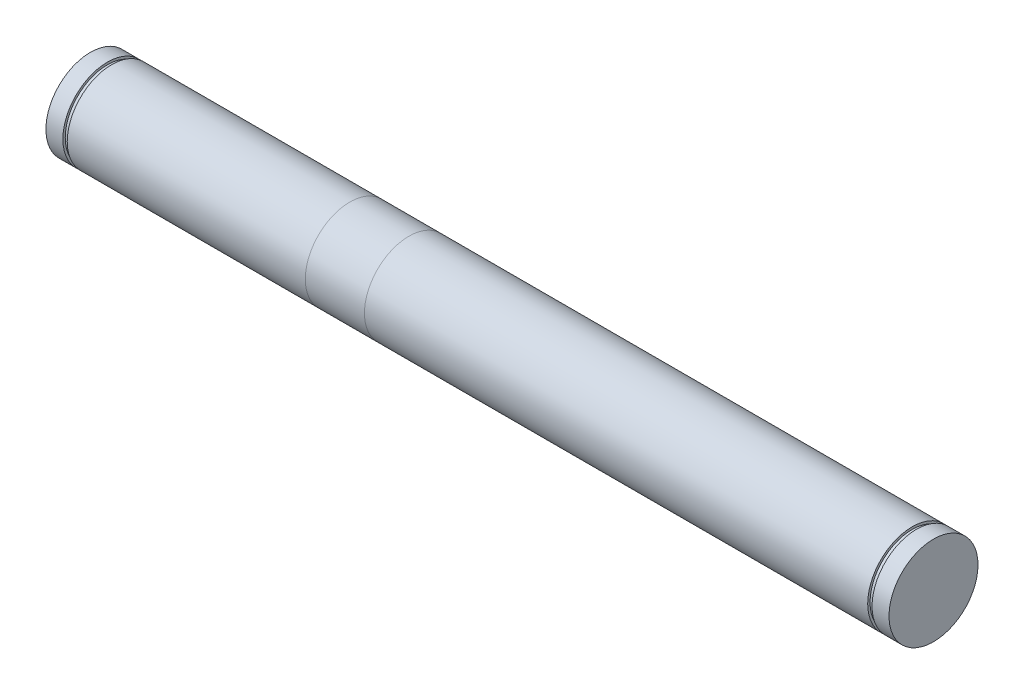
ISO-10303-21;
HEADER;
FILE_DESCRIPTION(('STEP AP214'),'2;1');
FILE_NAME('part.step','',(''),(''),'','','');
FILE_SCHEMA(('AUTOMOTIVE_DESIGN { 1 0 10303 214 1 1 1 1 }'));
ENDSEC;
DATA;
#1=APPLICATION_CONTEXT('core data for automotive mechanical design processes');
#2=APPLICATION_PROTOCOL_DEFINITION('international standard','automotive_design',2000,#1);
#3=PRODUCT_CONTEXT('',#1,'mechanical');
#4=PRODUCT('Part','Part','',(#3));
#5=PRODUCT_RELATED_PRODUCT_CATEGORY('part','',(#4));
#6=PRODUCT_DEFINITION_FORMATION('','',#4);
#7=PRODUCT_DEFINITION_CONTEXT('part definition',#1,'design');
#8=PRODUCT_DEFINITION('design','',#6,#7);
#9=PRODUCT_DEFINITION_SHAPE('','',#8);
#10=(LENGTH_UNIT() NAMED_UNIT(*) SI_UNIT(.MILLI.,.METRE.));
#11=(NAMED_UNIT(*) PLANE_ANGLE_UNIT() SI_UNIT($,.RADIAN.));
#12=(NAMED_UNIT(*) SI_UNIT($,.STERADIAN.) SOLID_ANGLE_UNIT());
#13=UNCERTAINTY_MEASURE_WITH_UNIT(LENGTH_MEASURE(1.E-05),#10,'distance_accuracy_value','');
#14=(GEOMETRIC_REPRESENTATION_CONTEXT(3) GLOBAL_UNCERTAINTY_ASSIGNED_CONTEXT((#13)) GLOBAL_UNIT_ASSIGNED_CONTEXT((#10,
#11,#12)) REPRESENTATION_CONTEXT('',''));
#15=CARTESIAN_POINT('',(0.,0.,0.));
#16=DIRECTION('',(0.,0.,1.));
#17=DIRECTION('',(1.,0.,0.));
#18=AXIS2_PLACEMENT_3D('',#15,#16,#17);
#19=CARTESIAN_POINT('',(180.,0.,0.));
#20=DIRECTION('',(1.,0.,0.));
#21=DIRECTION('',(0.,0.,-1.));
#22=AXIS2_PLACEMENT_3D('',#19,#20,#21);
#23=CYLINDRICAL_SURFACE('',#22,19.001);
#24=CARTESIAN_POINT('',(-44.,0.,0.));
#25=DIRECTION('',(1.,0.,0.));
#26=DIRECTION('',(0.,0.,-1.));
#27=AXIS2_PLACEMENT_3D('',#24,#25,#26);
#28=CIRCLE('',#27,19.001);
#29=CARTESIAN_POINT('',(-44.,0.,-19.001));
#30=VERTEX_POINT('',#29);
#31=EDGE_CURVE('E67',#30,#30,#28,.T.);
#32=ORIENTED_EDGE('',*,*,#31,.F.);
#33=EDGE_LOOP('',(#32));
#34=FACE_BOUND('',#33,.T.);
#35=CARTESIAN_POINT('',(-69.2296190995185,0.,0.));
#36=DIRECTION('',(-1.,0.,0.));
#37=DIRECTION('',(0.,0.,1.));
#38=AXIS2_PLACEMENT_3D('',#35,#36,#37);
#39=CIRCLE('',#38,19.001);
#40=CARTESIAN_POINT('',(-69.2296190995185,0.,19.001));
#41=VERTEX_POINT('',#40);
#42=EDGE_CURVE('E51',#41,#41,#39,.F.);
#43=ORIENTED_EDGE('',*,*,#42,.T.);
#44=EDGE_LOOP('',(#43));
#45=FACE_BOUND('',#44,.T.);
#46=ADVANCED_FACE('F47',(#34,#45),#23,.T.);
#47=CARTESIAN_POINT('',(180.,0.,0.));
#48=DIRECTION('',(1.,0.,0.));
#49=DIRECTION('',(0.,0.,-1.));
#50=AXIS2_PLACEMENT_3D('',#47,#48,#49);
#51=CYLINDRICAL_SURFACE('',#50,19.);
#52=CARTESIAN_POINT('',(-44.,0.,0.));
#53=DIRECTION('',(1.,0.,0.));
#54=DIRECTION('',(0.,0.,-1.));
#55=AXIS2_PLACEMENT_3D('',#52,#53,#54);
#56=CIRCLE('',#55,19.);
#57=CARTESIAN_POINT('',(-44.,0.,-19.));
#58=VERTEX_POINT('',#57);
#59=EDGE_CURVE('E61',#58,#58,#56,.T.);
#60=ORIENTED_EDGE('',*,*,#59,.T.);
#61=EDGE_LOOP('',(#60));
#62=FACE_BOUND('',#61,.T.);
#63=CARTESIAN_POINT('',(170.9,0.,0.));
#64=DIRECTION('',(-1.,0.,0.));
#65=DIRECTION('',(0.,0.,1.));
#66=AXIS2_PLACEMENT_3D('',#63,#64,#65);
#67=CIRCLE('',#66,19.);
#68=CARTESIAN_POINT('',(170.9,0.,19.));
#69=VERTEX_POINT('',#68);
#70=EDGE_CURVE('E83',#69,#69,#67,.T.);
#71=ORIENTED_EDGE('',*,*,#70,.T.);
#72=EDGE_LOOP('',(#71));
#73=FACE_BOUND('',#72,.T.);
#74=ADVANCED_FACE('F129',(#62,#73),#51,.T.);
#75=CARTESIAN_POINT('',(-44.,19.001,0.));
#76=DIRECTION('',(1.,0.,0.));
#77=DIRECTION('',(0.,0.,-1.));
#78=AXIS2_PLACEMENT_3D('',#75,#76,#77);
#79=PLANE('',#78);
#80=ORIENTED_EDGE('',*,*,#31,.T.);
#81=EDGE_LOOP('',(#80));
#82=FACE_BOUND('',#81,.T.);
#83=ORIENTED_EDGE('',*,*,#59,.F.);
#84=EDGE_LOOP('',(#83));
#85=FACE_BOUND('',#84,.T.);
#86=ADVANCED_FACE('F137',(#82,#85),#79,.T.);
#87=CARTESIAN_POINT('',(170.9,19.,0.));
#88=DIRECTION('',(1.,0.,0.));
#89=DIRECTION('',(0.,0.,-1.));
#90=AXIS2_PLACEMENT_3D('',#87,#88,#89);
#91=PLANE('',#90);
#92=CARTESIAN_POINT('',(170.9,0.,0.));
#93=DIRECTION('',(-1.,0.,0.));
#94=DIRECTION('',(0.,0.,1.));
#95=AXIS2_PLACEMENT_3D('',#92,#93,#94);
#96=CIRCLE('',#95,18.);
#97=CARTESIAN_POINT('',(170.9,0.,18.));
#98=VERTEX_POINT('',#97);
#99=EDGE_CURVE('E71',#98,#98,#96,.T.);
#100=ORIENTED_EDGE('',*,*,#99,.T.);
#101=EDGE_LOOP('',(#100));
#102=FACE_BOUND('',#101,.T.);
#103=ORIENTED_EDGE('',*,*,#70,.F.);
#104=EDGE_LOOP('',(#103));
#105=FACE_BOUND('',#104,.T.);
#106=ADVANCED_FACE('F142',(#102,#105),#91,.T.);
#107=CARTESIAN_POINT('',(-88.99,0.,0.));
#108=DIRECTION('',(-1.,0.,0.));
#109=DIRECTION('',(0.,0.,1.));
#110=AXIS2_PLACEMENT_3D('',#107,#108,#109);
#111=CYLINDRICAL_SURFACE('',#110,18.);
#112=CARTESIAN_POINT('',(172.75,0.,0.));
#113=DIRECTION('',(-1.,0.,0.));
#114=DIRECTION('',(0.,0.,1.));
#115=AXIS2_PLACEMENT_3D('',#112,#113,#114);
#116=CIRCLE('',#115,18.);
#117=CARTESIAN_POINT('',(172.75,0.,18.));
#118=VERTEX_POINT('',#117);
#119=EDGE_CURVE('E75',#118,#118,#116,.T.);
#120=ORIENTED_EDGE('',*,*,#119,.T.);
#121=EDGE_LOOP('',(#120));
#122=FACE_BOUND('',#121,.T.);
#123=ORIENTED_EDGE('',*,*,#99,.F.);
#124=EDGE_LOOP('',(#123));
#125=FACE_BOUND('',#124,.T.);
#126=ADVANCED_FACE('F153',(#122,#125),#111,.T.);
#127=CARTESIAN_POINT('',(172.75,19.,0.));
#128=DIRECTION('',(-1.,0.,0.));
#129=DIRECTION('',(0.,0.,1.));
#130=AXIS2_PLACEMENT_3D('',#127,#128,#129);
#131=PLANE('',#130);
#132=CARTESIAN_POINT('',(172.75,0.,0.));
#133=DIRECTION('',(-1.,0.,0.));
#134=DIRECTION('',(0.,0.,1.));
#135=AXIS2_PLACEMENT_3D('',#132,#133,#134);
#136=CIRCLE('',#135,19.);
#137=CARTESIAN_POINT('',(172.75,0.,19.));
#138=VERTEX_POINT('',#137);
#139=EDGE_CURVE('E79',#138,#138,#136,.T.);
#140=ORIENTED_EDGE('',*,*,#139,.T.);
#141=EDGE_LOOP('',(#140));
#142=FACE_BOUND('',#141,.T.);
#143=ORIENTED_EDGE('',*,*,#119,.F.);
#144=EDGE_LOOP('',(#143));
#145=FACE_BOUND('',#144,.T.);
#146=ADVANCED_FACE('F148',(#142,#145),#131,.T.);
#147=CARTESIAN_POINT('',(180.,19.,0.));
#148=DIRECTION('',(1.,0.,0.));
#149=DIRECTION('',(0.,0.,-1.));
#150=AXIS2_PLACEMENT_3D('',#147,#148,#149);
#151=PLANE('',#150);
#152=CARTESIAN_POINT('',(180.,0.,0.));
#153=DIRECTION('',(1.,0.,0.));
#154=DIRECTION('',(0.,0.,-1.));
#155=AXIS2_PLACEMENT_3D('',#152,#153,#154);
#156=CIRCLE('',#155,19.);
#157=CARTESIAN_POINT('',(180.,0.,-19.));
#158=VERTEX_POINT('',#157);
#159=EDGE_CURVE('E56',#158,#158,#156,.T.);
#160=ORIENTED_EDGE('',*,*,#159,.T.);
#161=EDGE_LOOP('',(#160));
#162=FACE_BOUND('',#161,.T.);
#163=ADVANCED_FACE('F126',(#162),#151,.T.);
#164=ORIENTED_EDGE('',*,*,#159,.F.);
#165=EDGE_LOOP('',(#164));
#166=FACE_BOUND('',#165,.T.);
#167=ORIENTED_EDGE('',*,*,#139,.F.);
#168=EDGE_LOOP('',(#167));
#169=FACE_BOUND('',#168,.T.);
#170=ADVANCED_FACE('F117',(#166,#169),#51,.T.);
#171=CARTESIAN_POINT('',(-69.2296190995185,19.,0.));
#172=DIRECTION('',(-1.,0.,0.));
#173=DIRECTION('',(0.,0.,1.));
#174=AXIS2_PLACEMENT_3D('',#171,#172,#173);
#175=PLANE('',#174);
#176=ORIENTED_EDGE('',*,*,#42,.F.);
#177=EDGE_LOOP('',(#176));
#178=FACE_BOUND('',#177,.T.);
#179=CARTESIAN_POINT('',(-69.2296190995185,0.,0.));
#180=DIRECTION('',(-1.,0.,0.));
#181=DIRECTION('',(0.,0.,1.));
#182=AXIS2_PLACEMENT_3D('',#179,#180,#181);
#183=CIRCLE('',#182,19.);
#184=CARTESIAN_POINT('',(-69.2296190995185,0.,19.));
#185=VERTEX_POINT('',#184);
#186=EDGE_CURVE('E103',#185,#185,#183,.T.);
#187=ORIENTED_EDGE('',*,*,#186,.F.);
#188=EDGE_LOOP('',(#187));
#189=FACE_BOUND('',#188,.T.);
#190=ADVANCED_FACE('F113',(#178,#189),#175,.T.);
#191=CARTESIAN_POINT('',(-180.,19.,0.));
#192=DIRECTION('',(-1.,0.,0.));
#193=DIRECTION('',(0.,0.,1.));
#194=AXIS2_PLACEMENT_3D('',#191,#192,#193);
#195=PLANE('',#194);
#196=CARTESIAN_POINT('',(-180.,0.,0.));
#197=DIRECTION('',(1.,0.,0.));
#198=DIRECTION('',(0.,0.,-1.));
#199=AXIS2_PLACEMENT_3D('',#196,#197,#198);
#200=CIRCLE('',#199,19.);
#201=CARTESIAN_POINT('',(-180.,0.,-19.));
#202=VERTEX_POINT('',#201);
#203=EDGE_CURVE('E10',#202,#202,#200,.T.);
#204=ORIENTED_EDGE('',*,*,#203,.F.);
#205=EDGE_LOOP('',(#204));
#206=FACE_BOUND('',#205,.T.);
#207=ADVANCED_FACE('F116',(#206),#195,.T.);
#208=CARTESIAN_POINT('',(180.,0.,0.));
#209=DIRECTION('',(1.,0.,0.));
#210=DIRECTION('',(0.,0.,-1.));
#211=AXIS2_PLACEMENT_3D('',#208,#209,#210);
#212=CYLINDRICAL_SURFACE('',#211,19.);
#213=ORIENTED_EDGE('',*,*,#203,.T.);
#214=EDGE_LOOP('',(#213));
#215=FACE_BOUND('',#214,.T.);
#216=CARTESIAN_POINT('',(-172.75,0.,0.));
#217=DIRECTION('',(-1.,0.,0.));
#218=DIRECTION('',(0.,0.,1.));
#219=AXIS2_PLACEMENT_3D('',#216,#217,#218);
#220=CIRCLE('',#219,19.);
#221=CARTESIAN_POINT('',(-172.75,0.,19.));
#222=VERTEX_POINT('',#221);
#223=EDGE_CURVE('E99',#222,#222,#220,.T.);
#224=ORIENTED_EDGE('',*,*,#223,.T.);
#225=EDGE_LOOP('',(#224));
#226=FACE_BOUND('',#225,.T.);
#227=ADVANCED_FACE('F49',(#215,#226),#212,.T.);
#228=CARTESIAN_POINT('',(-172.75,19.,0.));
#229=DIRECTION('',(1.,0.,0.));
#230=DIRECTION('',(0.,0.,-1.));
#231=AXIS2_PLACEMENT_3D('',#228,#229,#230);
#232=PLANE('',#231);
#233=CARTESIAN_POINT('',(-172.75,0.,0.));
#234=DIRECTION('',(-1.,0.,0.));
#235=DIRECTION('',(0.,0.,1.));
#236=AXIS2_PLACEMENT_3D('',#233,#234,#235);
#237=CIRCLE('',#236,18.);
#238=CARTESIAN_POINT('',(-172.75,0.,18.));
#239=VERTEX_POINT('',#238);
#240=EDGE_CURVE('E87',#239,#239,#237,.T.);
#241=ORIENTED_EDGE('',*,*,#240,.T.);
#242=EDGE_LOOP('',(#241));
#243=FACE_BOUND('',#242,.T.);
#244=ORIENTED_EDGE('',*,*,#223,.F.);
#245=EDGE_LOOP('',(#244));
#246=FACE_BOUND('',#245,.T.);
#247=ADVANCED_FACE('F199',(#243,#246),#232,.T.);
#248=CARTESIAN_POINT('',(-88.99,0.,0.));
#249=DIRECTION('',(-1.,0.,0.));
#250=DIRECTION('',(0.,0.,1.));
#251=AXIS2_PLACEMENT_3D('',#248,#249,#250);
#252=CYLINDRICAL_SURFACE('',#251,18.);
#253=CARTESIAN_POINT('',(-170.9,0.,0.));
#254=DIRECTION('',(-1.,0.,0.));
#255=DIRECTION('',(0.,0.,1.));
#256=AXIS2_PLACEMENT_3D('',#253,#254,#255);
#257=CIRCLE('',#256,18.);
#258=CARTESIAN_POINT('',(-170.9,0.,18.));
#259=VERTEX_POINT('',#258);
#260=EDGE_CURVE('E91',#259,#259,#257,.T.);
#261=ORIENTED_EDGE('',*,*,#260,.T.);
#262=EDGE_LOOP('',(#261));
#263=FACE_BOUND('',#262,.T.);
#264=ORIENTED_EDGE('',*,*,#240,.F.);
#265=EDGE_LOOP('',(#264));
#266=FACE_BOUND('',#265,.T.);
#267=ADVANCED_FACE('F203',(#263,#266),#252,.T.);
#268=CARTESIAN_POINT('',(-170.9,19.,0.));
#269=DIRECTION('',(-1.,0.,0.));
#270=DIRECTION('',(0.,0.,1.));
#271=AXIS2_PLACEMENT_3D('',#268,#269,#270);
#272=PLANE('',#271);
#273=CARTESIAN_POINT('',(-170.9,0.,0.));
#274=DIRECTION('',(-1.,0.,0.));
#275=DIRECTION('',(0.,0.,1.));
#276=AXIS2_PLACEMENT_3D('',#273,#274,#275);
#277=CIRCLE('',#276,19.);
#278=CARTESIAN_POINT('',(-170.9,0.,19.));
#279=VERTEX_POINT('',#278);
#280=EDGE_CURVE('E95',#279,#279,#277,.T.);
#281=ORIENTED_EDGE('',*,*,#280,.T.);
#282=EDGE_LOOP('',(#281));
#283=FACE_BOUND('',#282,.T.);
#284=ORIENTED_EDGE('',*,*,#260,.F.);
#285=EDGE_LOOP('',(#284));
#286=FACE_BOUND('',#285,.T.);
#287=ADVANCED_FACE('F215',(#283,#286),#272,.T.);
#288=ORIENTED_EDGE('',*,*,#186,.T.);
#289=EDGE_LOOP('',(#288));
#290=FACE_BOUND('',#289,.T.);
#291=ORIENTED_EDGE('',*,*,#280,.F.);
#292=EDGE_LOOP('',(#291));
#293=FACE_BOUND('',#292,.T.);
#294=ADVANCED_FACE('F225',(#290,#293),#212,.T.);
#295=CLOSED_SHELL('',(#46,#74,#86,#106,#126,#146,#163,#170,#190,#207,#227,#247,#267,#287,#294));
#296=MANIFOLD_SOLID_BREP('B2',#295);
#297=ADVANCED_BREP_SHAPE_REPRESENTATION('',(#18,#296),#14);
#298=SHAPE_DEFINITION_REPRESENTATION(#9,#297);
ENDSEC;
END-ISO-10303-21;
